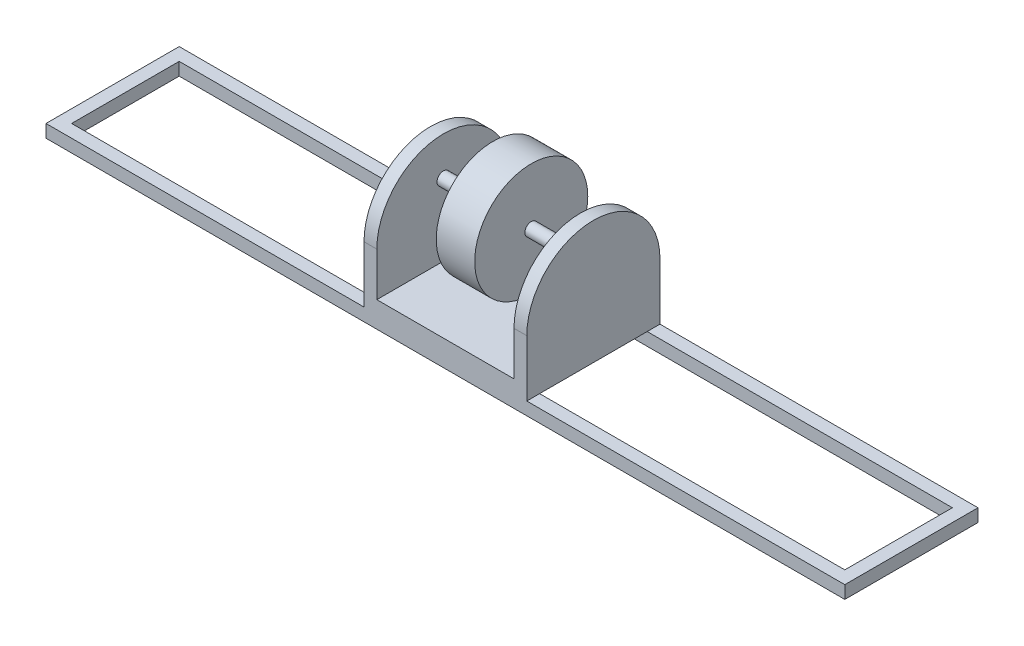
ISO-10303-21;
HEADER;
FILE_DESCRIPTION(('STEP AP214'),'2;1');
FILE_NAME('part.step','',(''),(''),'','','');
FILE_SCHEMA(('AUTOMOTIVE_DESIGN { 1 0 10303 214 1 1 1 1 }'));
ENDSEC;
DATA;
#1=APPLICATION_CONTEXT('core data for automotive mechanical design processes');
#2=APPLICATION_PROTOCOL_DEFINITION('international standard','automotive_design',2000,#1);
#3=PRODUCT_CONTEXT('',#1,'mechanical');
#4=PRODUCT('Part','Part','',(#3));
#5=PRODUCT_RELATED_PRODUCT_CATEGORY('part','',(#4));
#6=PRODUCT_DEFINITION_FORMATION('','',#4);
#7=PRODUCT_DEFINITION_CONTEXT('part definition',#1,'design');
#8=PRODUCT_DEFINITION('design','',#6,#7);
#9=PRODUCT_DEFINITION_SHAPE('','',#8);
#10=(LENGTH_UNIT() NAMED_UNIT(*) SI_UNIT(.MILLI.,.METRE.));
#11=(NAMED_UNIT(*) PLANE_ANGLE_UNIT() SI_UNIT($,.RADIAN.));
#12=(NAMED_UNIT(*) SI_UNIT($,.STERADIAN.) SOLID_ANGLE_UNIT());
#13=UNCERTAINTY_MEASURE_WITH_UNIT(LENGTH_MEASURE(1.E-05),#10,'distance_accuracy_value','');
#14=(GEOMETRIC_REPRESENTATION_CONTEXT(3) GLOBAL_UNCERTAINTY_ASSIGNED_CONTEXT((#13)) GLOBAL_UNIT_ASSIGNED_CONTEXT((#10,
#11,#12)) REPRESENTATION_CONTEXT('',''));
#15=CARTESIAN_POINT('',(0.,0.,0.));
#16=DIRECTION('',(0.,0.,1.));
#17=DIRECTION('',(1.,0.,0.));
#18=AXIS2_PLACEMENT_3D('',#15,#16,#17);
#19=CARTESIAN_POINT('',(155.284271247462,152.069350649587,-707.172403048339));
#20=DIRECTION('',(-1.,0.,0.));
#21=DIRECTION('',(0.,0.,1.));
#22=AXIS2_PLACEMENT_3D('',#19,#20,#21);
#23=CYLINDRICAL_SURFACE('',#22,9.99999999999998);
#24=CARTESIAN_POINT('',(-107.,152.069350649587,-707.172403048339));
#25=DIRECTION('',(1.,0.,0.));
#26=DIRECTION('',(0.,0.,-1.));
#27=AXIS2_PLACEMENT_3D('',#24,#25,#26);
#28=CIRCLE('',#27,9.99999999999998);
#29=CARTESIAN_POINT('',(-107.,152.069350649587,-717.172403048339));
#30=VERTEX_POINT('',#29);
#31=EDGE_CURVE('E394',#30,#30,#28,.T.);
#32=ORIENTED_EDGE('',*,*,#31,.T.);
#33=EDGE_LOOP('',(#32));
#34=FACE_BOUND('',#33,.T.);
#35=CARTESIAN_POINT('',(-30.,152.069350649587,-707.172403048339));
#36=DIRECTION('',(1.,0.,0.));
#37=DIRECTION('',(0.,0.,-1.));
#38=AXIS2_PLACEMENT_3D('',#35,#36,#37);
#39=CIRCLE('',#38,9.99999999999998);
#40=CARTESIAN_POINT('',(-30.,152.069350649587,-717.172403048339));
#41=VERTEX_POINT('',#40);
#42=EDGE_CURVE('E39',#41,#41,#39,.F.);
#43=ORIENTED_EDGE('',*,*,#42,.T.);
#44=EDGE_LOOP('',(#43));
#45=FACE_BOUND('',#44,.T.);
#46=ADVANCED_FACE('F35',(#34,#45),#23,.T.);
#47=CARTESIAN_POINT('',(0.,20.,0.));
#48=DIRECTION('',(0.,1.,0.));
#49=DIRECTION('',(0.,0.,1.));
#50=AXIS2_PLACEMENT_3D('',#47,#48,#49);
#51=PLANE('',#50);
#52=DIRECTION('',(0.,0.,-1.));
#53=VECTOR('',#52,1.);
#54=CARTESIAN_POINT('',(127.,20.,-811.094806096677));
#55=LINE('',#54,#53);
#56=CARTESIAN_POINT('',(127.,20.,-603.249999999996));
#57=VERTEX_POINT('',#56);
#58=CARTESIAN_POINT('',(127.,20.,-623.25));
#59=VERTEX_POINT('',#58);
#60=EDGE_CURVE('E219',#57,#59,#55,.T.);
#61=ORIENTED_EDGE('',*,*,#60,.F.);
#62=DIRECTION('',(-1.,0.,0.));
#63=VECTOR('',#62,1.);
#64=CARTESIAN_POINT('',(3.34871019802561E-12,20.,-603.249999999997));
#65=LINE('',#64,#63);
#66=CARTESIAN_POINT('',(623.25,20.,-603.25));
#67=VERTEX_POINT('',#66);
#68=EDGE_CURVE('E237',#67,#57,#65,.T.);
#69=ORIENTED_EDGE('',*,*,#68,.F.);
#70=DIRECTION('',(0.,0.,1.));
#71=VECTOR('',#70,1.);
#72=CARTESIAN_POINT('',(623.25,20.,0.));
#73=LINE('',#72,#71);
#74=CARTESIAN_POINT('',(623.25,20.,-811.094806096677));
#75=VERTEX_POINT('',#74);
#76=EDGE_CURVE('E240',#75,#67,#73,.T.);
#77=ORIENTED_EDGE('',*,*,#76,.F.);
#78=DIRECTION('',(1.,0.,0.));
#79=VECTOR('',#78,1.);
#80=CARTESIAN_POINT('',(0.,20.,-811.094806096677));
#81=LINE('',#80,#79);
#82=CARTESIAN_POINT('',(127.,20.,-811.094806096677));
#83=VERTEX_POINT('',#82);
#84=EDGE_CURVE('E244',#83,#75,#81,.T.);
#85=ORIENTED_EDGE('',*,*,#84,.F.);
#86=CARTESIAN_POINT('',(127.,20.,-791.094806096677));
#87=VERTEX_POINT('',#86);
#88=EDGE_CURVE('E44',#87,#83,#55,.T.);
#89=ORIENTED_EDGE('',*,*,#88,.F.);
#90=DIRECTION('',(1.,0.,0.));
#91=VECTOR('',#90,1.);
#92=CARTESIAN_POINT('',(0.,20.,-791.094806096677));
#93=LINE('',#92,#91);
#94=CARTESIAN_POINT('',(603.25,20.,-791.094806096677));
#95=VERTEX_POINT('',#94);
#96=EDGE_CURVE('E251',#87,#95,#93,.T.);
#97=ORIENTED_EDGE('',*,*,#96,.T.);
#98=DIRECTION('',(0.,0.,1.));
#99=VECTOR('',#98,1.);
#100=CARTESIAN_POINT('',(603.25,20.,0.));
#101=LINE('',#100,#99);
#102=CARTESIAN_POINT('',(603.25,20.,-623.25));
#103=VERTEX_POINT('',#102);
#104=EDGE_CURVE('E254',#95,#103,#101,.T.);
#105=ORIENTED_EDGE('',*,*,#104,.T.);
#106=DIRECTION('',(1.,0.,0.));
#107=VECTOR('',#106,1.);
#108=CARTESIAN_POINT('',(0.,20.,-623.25));
#109=LINE('',#108,#107);
#110=EDGE_CURVE('E258',#59,#103,#109,.T.);
#111=ORIENTED_EDGE('',*,*,#110,.F.);
#112=EDGE_LOOP('',(#61,#69,#77,#85,#89,#97,#105,#111));
#113=FACE_BOUND('',#112,.T.);
#114=ADVANCED_FACE('F319',(#113),#51,.T.);
#115=CARTESIAN_POINT('',(0.,20.,-791.094806096677));
#116=DIRECTION('',(0.,0.,-1.));
#117=DIRECTION('',(-1.,0.,0.));
#118=AXIS2_PLACEMENT_3D('',#115,#116,#117);
#119=PLANE('',#118);
#120=DIRECTION('',(1.,0.,0.));
#121=VECTOR('',#120,1.);
#122=CARTESIAN_POINT('',(0.,0.,-791.094806096677));
#123=LINE('',#122,#121);
#124=CARTESIAN_POINT('',(-603.25,0.,-791.094806096677));
#125=VERTEX_POINT('',#124);
#126=CARTESIAN_POINT('',(603.25,0.,-791.094806096677));
#127=VERTEX_POINT('',#126);
#128=EDGE_CURVE('E277',#125,#127,#123,.T.);
#129=ORIENTED_EDGE('',*,*,#128,.T.);
#130=DIRECTION('',(0.,-1.,0.));
#131=VECTOR('',#130,1.);
#132=CARTESIAN_POINT('',(603.25,20.,-791.094806096677));
#133=LINE('',#132,#131);
#134=EDGE_CURVE('E296',#95,#127,#133,.T.);
#135=ORIENTED_EDGE('',*,*,#134,.F.);
#136=ORIENTED_EDGE('',*,*,#96,.F.);
#137=CARTESIAN_POINT('',(-127.,20.,-791.094806096677));
#138=VERTEX_POINT('',#137);
#139=EDGE_CURVE('E255',#138,#87,#93,.T.);
#140=ORIENTED_EDGE('',*,*,#139,.F.);
#141=CARTESIAN_POINT('',(-603.25,20.,-791.094806096677));
#142=VERTEX_POINT('',#141);
#143=EDGE_CURVE('E252',#142,#138,#93,.T.);
#144=ORIENTED_EDGE('',*,*,#143,.F.);
#145=DIRECTION('',(0.,-1.,0.));
#146=VECTOR('',#145,1.);
#147=CARTESIAN_POINT('',(-603.25,20.,-791.094806096677));
#148=LINE('',#147,#146);
#149=EDGE_CURVE('E288',#142,#125,#148,.T.);
#150=ORIENTED_EDGE('',*,*,#149,.T.);
#151=EDGE_LOOP('',(#129,#135,#136,#140,#144,#150));
#152=FACE_BOUND('',#151,.T.);
#153=ADVANCED_FACE('F374',(#152),#119,.F.);
#154=CARTESIAN_POINT('',(603.25,20.,0.));
#155=DIRECTION('',(1.,0.,0.));
#156=DIRECTION('',(0.,0.,-1.));
#157=AXIS2_PLACEMENT_3D('',#154,#155,#156);
#158=PLANE('',#157);
#159=DIRECTION('',(0.,0.,1.));
#160=VECTOR('',#159,1.);
#161=CARTESIAN_POINT('',(603.25,0.,0.));
#162=LINE('',#161,#160);
#163=CARTESIAN_POINT('',(603.25,0.,-623.25));
#164=VERTEX_POINT('',#163);
#165=EDGE_CURVE('E280',#127,#164,#162,.T.);
#166=ORIENTED_EDGE('',*,*,#165,.T.);
#167=DIRECTION('',(0.,-1.,0.));
#168=VECTOR('',#167,1.);
#169=CARTESIAN_POINT('',(603.25,20.,-623.25));
#170=LINE('',#169,#168);
#171=EDGE_CURVE('E294',#103,#164,#170,.T.);
#172=ORIENTED_EDGE('',*,*,#171,.F.);
#173=ORIENTED_EDGE('',*,*,#104,.F.);
#174=ORIENTED_EDGE('',*,*,#134,.T.);
#175=EDGE_LOOP('',(#166,#172,#173,#174));
#176=FACE_BOUND('',#175,.T.);
#177=ADVANCED_FACE('F344',(#176),#158,.F.);
#178=CARTESIAN_POINT('',(0.,20.,-623.25));
#179=DIRECTION('',(0.,0.,-1.));
#180=DIRECTION('',(-1.,0.,0.));
#181=AXIS2_PLACEMENT_3D('',#178,#179,#180);
#182=PLANE('',#181);
#183=DIRECTION('',(1.,0.,0.));
#184=VECTOR('',#183,1.);
#185=CARTESIAN_POINT('',(0.,0.,-623.25));
#186=LINE('',#185,#184);
#187=CARTESIAN_POINT('',(-603.25,0.,-623.25));
#188=VERTEX_POINT('',#187);
#189=EDGE_CURVE('E283',#188,#164,#186,.T.);
#190=ORIENTED_EDGE('',*,*,#189,.F.);
#191=DIRECTION('',(0.,-1.,0.));
#192=VECTOR('',#191,1.);
#193=CARTESIAN_POINT('',(-603.25,20.,-623.25));
#194=LINE('',#193,#192);
#195=CARTESIAN_POINT('',(-603.25,20.,-623.25));
#196=VERTEX_POINT('',#195);
#197=EDGE_CURVE('E291',#196,#188,#194,.T.);
#198=ORIENTED_EDGE('',*,*,#197,.F.);
#199=CARTESIAN_POINT('',(-127.,20.,-623.25));
#200=VERTEX_POINT('',#199);
#201=EDGE_CURVE('E259',#196,#200,#109,.T.);
#202=ORIENTED_EDGE('',*,*,#201,.T.);
#203=EDGE_CURVE('E263',#200,#59,#109,.T.);
#204=ORIENTED_EDGE('',*,*,#203,.T.);
#205=ORIENTED_EDGE('',*,*,#110,.T.);
#206=ORIENTED_EDGE('',*,*,#171,.T.);
#207=EDGE_LOOP('',(#190,#198,#202,#204,#205,#206));
#208=FACE_BOUND('',#207,.T.);
#209=ADVANCED_FACE('F339',(#208),#182,.T.);
#210=CARTESIAN_POINT('',(3.34871019802561E-12,20.,-603.249999999997));
#211=DIRECTION('',(0.,0.,1.));
#212=DIRECTION('',(1.,0.,0.));
#213=AXIS2_PLACEMENT_3D('',#210,#211,#212);
#214=PLANE('',#213);
#215=DIRECTION('',(-1.,0.,0.));
#216=VECTOR('',#215,1.);
#217=CARTESIAN_POINT('',(3.34871019802561E-12,0.,-603.249999999997));
#218=LINE('',#217,#216);
#219=CARTESIAN_POINT('',(623.25,0.,-603.25));
#220=VERTEX_POINT('',#219);
#221=CARTESIAN_POINT('',(-623.25,0.,-603.25));
#222=VERTEX_POINT('',#221);
#223=EDGE_CURVE('E236',#220,#222,#218,.T.);
#224=ORIENTED_EDGE('',*,*,#223,.F.);
#225=DIRECTION('',(0.,-1.,0.));
#226=VECTOR('',#225,1.);
#227=CARTESIAN_POINT('',(623.25,20.,-603.25));
#228=LINE('',#227,#226);
#229=EDGE_CURVE('E292',#67,#220,#228,.T.);
#230=ORIENTED_EDGE('',*,*,#229,.F.);
#231=ORIENTED_EDGE('',*,*,#68,.T.);
#232=DIRECTION('',(0.,-1.,0.));
#233=VECTOR('',#232,1.);
#234=CARTESIAN_POINT('',(127.,40.,-603.25));
#235=LINE('',#234,#233);
#236=CARTESIAN_POINT('',(127.,108.279126424293,-603.25));
#237=VERTEX_POINT('',#236);
#238=EDGE_CURVE('E218',#237,#57,#235,.T.);
#239=ORIENTED_EDGE('',*,*,#238,.F.);
#240=DIRECTION('',(1.,0.,0.));
#241=VECTOR('',#240,1.);
#242=CARTESIAN_POINT('',(107.,108.279126424293,-603.25));
#243=LINE('',#242,#241);
#244=CARTESIAN_POINT('',(107.,108.279126424293,-603.25));
#245=VERTEX_POINT('',#244);
#246=EDGE_CURVE('E180',#245,#237,#243,.T.);
#247=ORIENTED_EDGE('',*,*,#246,.F.);
#248=DIRECTION('',(0.,1.,0.));
#249=VECTOR('',#248,1.);
#250=CARTESIAN_POINT('',(107.,40.,-603.25));
#251=LINE('',#250,#249);
#252=CARTESIAN_POINT('',(107.,40.,-603.25));
#253=VERTEX_POINT('',#252);
#254=EDGE_CURVE('E167',#253,#245,#251,.T.);
#255=ORIENTED_EDGE('',*,*,#254,.F.);
#256=DIRECTION('',(1.,0.,0.));
#257=VECTOR('',#256,1.);
#258=CARTESIAN_POINT('',(127.,40.,-603.25));
#259=LINE('',#258,#257);
#260=CARTESIAN_POINT('',(-107.,40.,-603.25));
#261=VERTEX_POINT('',#260);
#262=EDGE_CURVE('E51',#261,#253,#259,.T.);
#263=ORIENTED_EDGE('',*,*,#262,.F.);
#264=DIRECTION('',(0.,1.,0.));
#265=VECTOR('',#264,1.);
#266=CARTESIAN_POINT('',(-107.,40.,-603.25));
#267=LINE('',#266,#265);
#268=CARTESIAN_POINT('',(-107.,108.279126424293,-603.25));
#269=VERTEX_POINT('',#268);
#270=EDGE_CURVE('E200',#261,#269,#267,.T.);
#271=ORIENTED_EDGE('',*,*,#270,.T.);
#272=DIRECTION('',(-1.,0.,0.));
#273=VECTOR('',#272,1.);
#274=CARTESIAN_POINT('',(-107.,108.279126424293,-603.25));
#275=LINE('',#274,#273);
#276=CARTESIAN_POINT('',(-127.,108.279126424293,-603.25));
#277=VERTEX_POINT('',#276);
#278=EDGE_CURVE('E206',#269,#277,#275,.T.);
#279=ORIENTED_EDGE('',*,*,#278,.T.);
#280=DIRECTION('',(0.,-1.,0.));
#281=VECTOR('',#280,1.);
#282=CARTESIAN_POINT('',(-127.,40.,-603.25));
#283=LINE('',#282,#281);
#284=CARTESIAN_POINT('',(-127.,20.,-603.25));
#285=VERTEX_POINT('',#284);
#286=EDGE_CURVE('E228',#277,#285,#283,.T.);
#287=ORIENTED_EDGE('',*,*,#286,.T.);
#288=CARTESIAN_POINT('',(-623.25,20.,-603.25));
#289=VERTEX_POINT('',#288);
#290=EDGE_CURVE('E241',#285,#289,#65,.T.);
#291=ORIENTED_EDGE('',*,*,#290,.T.);
#292=DIRECTION('',(0.,-1.,0.));
#293=VECTOR('',#292,1.);
#294=CARTESIAN_POINT('',(-623.25,20.,-603.25));
#295=LINE('',#294,#293);
#296=EDGE_CURVE('E265',#289,#222,#295,.T.);
#297=ORIENTED_EDGE('',*,*,#296,.T.);
#298=EDGE_LOOP('',(#224,#230,#231,#239,#247,#255,#263,#271,#279,#287,#291,#297));
#299=FACE_BOUND('',#298,.T.);
#300=ADVANCED_FACE('F37',(#299),#214,.T.);
#301=CARTESIAN_POINT('',(623.25,20.,0.));
#302=DIRECTION('',(1.,0.,0.));
#303=DIRECTION('',(0.,0.,-1.));
#304=AXIS2_PLACEMENT_3D('',#301,#302,#303);
#305=PLANE('',#304);
#306=DIRECTION('',(0.,0.,1.));
#307=VECTOR('',#306,1.);
#308=CARTESIAN_POINT('',(623.25,0.,0.));
#309=LINE('',#308,#307);
#310=CARTESIAN_POINT('',(623.25,0.,-811.094806096677));
#311=VERTEX_POINT('',#310);
#312=EDGE_CURVE('E268',#311,#220,#309,.T.);
#313=ORIENTED_EDGE('',*,*,#312,.F.);
#314=DIRECTION('',(0.,-1.,0.));
#315=VECTOR('',#314,1.);
#316=CARTESIAN_POINT('',(623.25,20.,-811.094806096677));
#317=LINE('',#316,#315);
#318=EDGE_CURVE('E302',#75,#311,#317,.T.);
#319=ORIENTED_EDGE('',*,*,#318,.F.);
#320=ORIENTED_EDGE('',*,*,#76,.T.);
#321=ORIENTED_EDGE('',*,*,#229,.T.);
#322=EDGE_LOOP('',(#313,#319,#320,#321));
#323=FACE_BOUND('',#322,.T.);
#324=ADVANCED_FACE('F307',(#323),#305,.T.);
#325=CARTESIAN_POINT('',(0.,20.,-811.094806096677));
#326=DIRECTION('',(0.,0.,-1.));
#327=DIRECTION('',(-1.,0.,0.));
#328=AXIS2_PLACEMENT_3D('',#325,#326,#327);
#329=PLANE('',#328);
#330=DIRECTION('',(1.,0.,0.));
#331=VECTOR('',#330,1.);
#332=CARTESIAN_POINT('',(0.,0.,-811.094806096677));
#333=LINE('',#332,#331);
#334=CARTESIAN_POINT('',(-623.25,0.,-811.094806096677));
#335=VERTEX_POINT('',#334);
#336=EDGE_CURVE('E271',#335,#311,#333,.T.);
#337=ORIENTED_EDGE('',*,*,#336,.F.);
#338=DIRECTION('',(0.,-1.,0.));
#339=VECTOR('',#338,1.);
#340=CARTESIAN_POINT('',(-623.25,20.,-811.094806096677));
#341=LINE('',#340,#339);
#342=CARTESIAN_POINT('',(-623.25,20.,-811.094806096677));
#343=VERTEX_POINT('',#342);
#344=EDGE_CURVE('E300',#343,#335,#341,.T.);
#345=ORIENTED_EDGE('',*,*,#344,.F.);
#346=CARTESIAN_POINT('',(-127.,20.,-811.094806096677));
#347=VERTEX_POINT('',#346);
#348=EDGE_CURVE('E245',#343,#347,#81,.T.);
#349=ORIENTED_EDGE('',*,*,#348,.T.);
#350=DIRECTION('',(0.,-1.,0.));
#351=VECTOR('',#350,1.);
#352=CARTESIAN_POINT('',(-127.,40.,-811.094806096677));
#353=LINE('',#352,#351);
#354=CARTESIAN_POINT('',(-127.,108.279126424293,-811.094806096677));
#355=VERTEX_POINT('',#354);
#356=EDGE_CURVE('E231',#355,#347,#353,.T.);
#357=ORIENTED_EDGE('',*,*,#356,.F.);
#358=DIRECTION('',(-1.,0.,0.));
#359=VECTOR('',#358,1.);
#360=CARTESIAN_POINT('',(-107.,108.279126424293,-811.094806096677));
#361=LINE('',#360,#359);
#362=CARTESIAN_POINT('',(-107.,108.279126424293,-811.094806096677));
#363=VERTEX_POINT('',#362);
#364=EDGE_CURVE('E209',#363,#355,#361,.T.);
#365=ORIENTED_EDGE('',*,*,#364,.F.);
#366=DIRECTION('',(0.,-1.,0.));
#367=VECTOR('',#366,1.);
#368=CARTESIAN_POINT('',(-107.,40.,-811.094806096677));
#369=LINE('',#368,#367);
#370=CARTESIAN_POINT('',(-107.,40.,-811.094806096677));
#371=VERTEX_POINT('',#370);
#372=EDGE_CURVE('E196',#363,#371,#369,.T.);
#373=ORIENTED_EDGE('',*,*,#372,.T.);
#374=DIRECTION('',(-1.,0.,0.));
#375=VECTOR('',#374,1.);
#376=CARTESIAN_POINT('',(127.,40.,-811.094806096677));
#377=LINE('',#376,#375);
#378=CARTESIAN_POINT('',(107.,40.,-811.094806096677));
#379=VERTEX_POINT('',#378);
#380=EDGE_CURVE('E185',#379,#371,#377,.T.);
#381=ORIENTED_EDGE('',*,*,#380,.F.);
#382=DIRECTION('',(0.,-1.,0.));
#383=VECTOR('',#382,1.);
#384=CARTESIAN_POINT('',(107.,40.,-811.094806096677));
#385=LINE('',#384,#383);
#386=CARTESIAN_POINT('',(107.,108.279126424293,-811.094806096677));
#387=VERTEX_POINT('',#386);
#388=EDGE_CURVE('E165',#387,#379,#385,.T.);
#389=ORIENTED_EDGE('',*,*,#388,.F.);
#390=DIRECTION('',(1.,0.,0.));
#391=VECTOR('',#390,1.);
#392=CARTESIAN_POINT('',(107.,108.279126424293,-811.094806096677));
#393=LINE('',#392,#391);
#394=CARTESIAN_POINT('',(127.,108.279126424293,-811.094806096677));
#395=VERTEX_POINT('',#394);
#396=EDGE_CURVE('E174',#387,#395,#393,.T.);
#397=ORIENTED_EDGE('',*,*,#396,.T.);
#398=DIRECTION('',(0.,-1.,0.));
#399=VECTOR('',#398,1.);
#400=CARTESIAN_POINT('',(127.,40.,-811.094806096677));
#401=LINE('',#400,#399);
#402=EDGE_CURVE('E234',#395,#83,#401,.T.);
#403=ORIENTED_EDGE('',*,*,#402,.T.);
#404=ORIENTED_EDGE('',*,*,#84,.T.);
#405=ORIENTED_EDGE('',*,*,#318,.T.);
#406=EDGE_LOOP('',(#337,#345,#349,#357,#365,#373,#381,#389,#397,#403,#404,#405));
#407=FACE_BOUND('',#406,.T.);
#408=ADVANCED_FACE('F183',(#407),#329,.T.);
#409=CARTESIAN_POINT('',(-623.25,20.,0.));
#410=DIRECTION('',(-1.,0.,0.));
#411=DIRECTION('',(0.,0.,1.));
#412=AXIS2_PLACEMENT_3D('',#409,#410,#411);
#413=PLANE('',#412);
#414=DIRECTION('',(0.,0.,-1.));
#415=VECTOR('',#414,1.);
#416=CARTESIAN_POINT('',(-623.25,0.,0.));
#417=LINE('',#416,#415);
#418=EDGE_CURVE('E274',#222,#335,#417,.T.);
#419=ORIENTED_EDGE('',*,*,#418,.F.);
#420=ORIENTED_EDGE('',*,*,#296,.F.);
#421=DIRECTION('',(0.,0.,-1.));
#422=VECTOR('',#421,1.);
#423=CARTESIAN_POINT('',(-623.25,20.,0.));
#424=LINE('',#423,#422);
#425=EDGE_CURVE('E248',#289,#343,#424,.T.);
#426=ORIENTED_EDGE('',*,*,#425,.T.);
#427=ORIENTED_EDGE('',*,*,#344,.T.);
#428=EDGE_LOOP('',(#419,#420,#426,#427));
#429=FACE_BOUND('',#428,.T.);
#430=ADVANCED_FACE('F357',(#429),#413,.T.);
#431=CARTESIAN_POINT('',(-603.25,20.,0.));
#432=DIRECTION('',(-1.,0.,0.));
#433=DIRECTION('',(0.,0.,1.));
#434=AXIS2_PLACEMENT_3D('',#431,#432,#433);
#435=PLANE('',#434);
#436=DIRECTION('',(0.,0.,-1.));
#437=VECTOR('',#436,1.);
#438=CARTESIAN_POINT('',(-603.25,0.,0.));
#439=LINE('',#438,#437);
#440=EDGE_CURVE('E286',#188,#125,#439,.T.);
#441=ORIENTED_EDGE('',*,*,#440,.T.);
#442=ORIENTED_EDGE('',*,*,#149,.F.);
#443=DIRECTION('',(0.,0.,-1.));
#444=VECTOR('',#443,1.);
#445=CARTESIAN_POINT('',(-603.25,20.,0.));
#446=LINE('',#445,#444);
#447=EDGE_CURVE('E262',#196,#142,#446,.T.);
#448=ORIENTED_EDGE('',*,*,#447,.F.);
#449=ORIENTED_EDGE('',*,*,#197,.T.);
#450=EDGE_LOOP('',(#441,#442,#448,#449));
#451=FACE_BOUND('',#450,.T.);
#452=ADVANCED_FACE('F351',(#451),#435,.F.);
#453=DIRECTION('',(0.,0.,1.));
#454=VECTOR('',#453,1.);
#455=CARTESIAN_POINT('',(-127.,20.,-811.094806096677));
#456=LINE('',#455,#454);
#457=EDGE_CURVE('E216',#347,#138,#456,.T.);
#458=ORIENTED_EDGE('',*,*,#457,.F.);
#459=ORIENTED_EDGE('',*,*,#348,.F.);
#460=ORIENTED_EDGE('',*,*,#425,.F.);
#461=ORIENTED_EDGE('',*,*,#290,.F.);
#462=EDGE_CURVE('E225',#200,#285,#456,.T.);
#463=ORIENTED_EDGE('',*,*,#462,.F.);
#464=ORIENTED_EDGE('',*,*,#201,.F.);
#465=ORIENTED_EDGE('',*,*,#447,.T.);
#466=ORIENTED_EDGE('',*,*,#143,.T.);
#467=EDGE_LOOP('',(#458,#459,#460,#461,#463,#464,#465,#466));
#468=FACE_BOUND('',#467,.T.);
#469=ADVANCED_FACE('F354',(#468),#51,.T.);
#470=CARTESIAN_POINT('',(0.,0.,0.));
#471=DIRECTION('',(0.,1.,0.));
#472=DIRECTION('',(0.,0.,1.));
#473=AXIS2_PLACEMENT_3D('',#470,#471,#472);
#474=PLANE('',#473);
#475=ORIENTED_EDGE('',*,*,#223,.T.);
#476=ORIENTED_EDGE('',*,*,#418,.T.);
#477=ORIENTED_EDGE('',*,*,#336,.T.);
#478=ORIENTED_EDGE('',*,*,#312,.T.);
#479=EDGE_LOOP('',(#475,#476,#477,#478));
#480=FACE_BOUND('',#479,.T.);
#481=ORIENTED_EDGE('',*,*,#128,.F.);
#482=ORIENTED_EDGE('',*,*,#440,.F.);
#483=ORIENTED_EDGE('',*,*,#189,.T.);
#484=ORIENTED_EDGE('',*,*,#165,.F.);
#485=EDGE_LOOP('',(#481,#482,#483,#484));
#486=FACE_BOUND('',#485,.T.);
#487=ADVANCED_FACE('F315',(#480,#486),#474,.F.);
#488=CARTESIAN_POINT('',(0.,20.,0.));
#489=DIRECTION('',(0.,-1.,0.));
#490=DIRECTION('',(0.,0.,-1.));
#491=AXIS2_PLACEMENT_3D('',#488,#489,#490);
#492=PLANE('',#491);
#493=EDGE_CURVE('E222',#138,#200,#456,.T.);
#494=ORIENTED_EDGE('',*,*,#493,.F.);
#495=ORIENTED_EDGE('',*,*,#139,.T.);
#496=EDGE_CURVE('E212',#59,#87,#55,.T.);
#497=ORIENTED_EDGE('',*,*,#496,.F.);
#498=ORIENTED_EDGE('',*,*,#203,.F.);
#499=EDGE_LOOP('',(#494,#495,#497,#498));
#500=FACE_BOUND('',#499,.T.);
#501=ADVANCED_FACE('F334',(#500),#492,.T.);
#502=CARTESIAN_POINT('',(127.,40.,-811.094806096677));
#503=DIRECTION('',(-1.,0.,0.));
#504=DIRECTION('',(0.,0.,1.));
#505=AXIS2_PLACEMENT_3D('',#502,#503,#504);
#506=PLANE('',#505);
#507=ORIENTED_EDGE('',*,*,#60,.T.);
#508=ORIENTED_EDGE('',*,*,#496,.T.);
#509=ORIENTED_EDGE('',*,*,#88,.T.);
#510=ORIENTED_EDGE('',*,*,#402,.F.);
#511=CARTESIAN_POINT('',(127.,108.279126424293,-707.172403048339));
#512=DIRECTION('',(-1.,0.,0.));
#513=DIRECTION('',(0.,0.,-1.));
#514=AXIS2_PLACEMENT_3D('',#511,#512,#513);
#515=CIRCLE('',#514,103.922403048339);
#516=EDGE_CURVE('E177',#237,#395,#515,.T.);
#517=ORIENTED_EDGE('',*,*,#516,.F.);
#518=ORIENTED_EDGE('',*,*,#238,.T.);
#519=EDGE_LOOP('',(#507,#508,#509,#510,#517,#518));
#520=FACE_BOUND('',#519,.T.);
#521=ADVANCED_FACE('F322',(#520),#506,.F.);
#522=CARTESIAN_POINT('',(-127.,40.,-811.094806096677));
#523=DIRECTION('',(1.,0.,0.));
#524=DIRECTION('',(0.,0.,-1.));
#525=AXIS2_PLACEMENT_3D('',#522,#523,#524);
#526=PLANE('',#525);
#527=ORIENTED_EDGE('',*,*,#457,.T.);
#528=ORIENTED_EDGE('',*,*,#493,.T.);
#529=ORIENTED_EDGE('',*,*,#462,.T.);
#530=ORIENTED_EDGE('',*,*,#286,.F.);
#531=CARTESIAN_POINT('',(-127.,108.279126424293,-707.172403048339));
#532=DIRECTION('',(-1.,0.,0.));
#533=DIRECTION('',(0.,0.,-1.));
#534=AXIS2_PLACEMENT_3D('',#531,#532,#533);
#535=CIRCLE('',#534,103.922403048339);
#536=EDGE_CURVE('E194',#277,#355,#535,.T.);
#537=ORIENTED_EDGE('',*,*,#536,.T.);
#538=ORIENTED_EDGE('',*,*,#356,.T.);
#539=EDGE_LOOP('',(#527,#528,#529,#530,#537,#538));
#540=FACE_BOUND('',#539,.T.);
#541=ADVANCED_FACE('F330',(#540),#526,.F.);
#542=CARTESIAN_POINT('',(0.,40.,0.));
#543=DIRECTION('',(0.,-1.,0.));
#544=DIRECTION('',(0.,0.,-1.));
#545=AXIS2_PLACEMENT_3D('',#542,#543,#544);
#546=PLANE('',#545);
#547=ORIENTED_EDGE('',*,*,#262,.T.);
#548=DIRECTION('',(0.,0.,1.));
#549=VECTOR('',#548,1.);
#550=CARTESIAN_POINT('',(107.,40.,-811.094806096677));
#551=LINE('',#550,#549);
#552=EDGE_CURVE('E55',#379,#253,#551,.T.);
#553=ORIENTED_EDGE('',*,*,#552,.F.);
#554=ORIENTED_EDGE('',*,*,#380,.T.);
#555=DIRECTION('',(0.,0.,1.));
#556=VECTOR('',#555,1.);
#557=CARTESIAN_POINT('',(-107.,40.,-811.094806096677));
#558=LINE('',#557,#556);
#559=EDGE_CURVE('E198',#371,#261,#558,.T.);
#560=ORIENTED_EDGE('',*,*,#559,.T.);
#561=EDGE_LOOP('',(#547,#553,#554,#560));
#562=FACE_BOUND('',#561,.T.);
#563=ADVANCED_FACE('F438',(#562),#546,.F.);
#564=CARTESIAN_POINT('',(-107.,108.279126424293,-707.172403048339));
#565=DIRECTION('',(-1.,0.,0.));
#566=DIRECTION('',(0.,0.,1.));
#567=AXIS2_PLACEMENT_3D('',#564,#565,#566);
#568=CYLINDRICAL_SURFACE('',#567,103.922403048339);
#569=ORIENTED_EDGE('',*,*,#536,.F.);
#570=ORIENTED_EDGE('',*,*,#278,.F.);
#571=CARTESIAN_POINT('',(-107.,108.279126424293,-707.172403048339));
#572=DIRECTION('',(-1.,0.,0.));
#573=DIRECTION('',(0.,0.,-1.));
#574=AXIS2_PLACEMENT_3D('',#571,#572,#573);
#575=CIRCLE('',#574,103.922403048339);
#576=EDGE_CURVE('E203',#269,#363,#575,.T.);
#577=ORIENTED_EDGE('',*,*,#576,.T.);
#578=ORIENTED_EDGE('',*,*,#364,.T.);
#579=EDGE_LOOP('',(#569,#570,#577,#578));
#580=FACE_BOUND('',#579,.T.);
#581=ADVANCED_FACE('F477',(#580),#568,.T.);
#582=CARTESIAN_POINT('',(-107.,108.279126424293,-707.172403048339));
#583=DIRECTION('',(1.,0.,0.));
#584=DIRECTION('',(0.,0.,-1.));
#585=AXIS2_PLACEMENT_3D('',#582,#583,#584);
#586=PLANE('',#585);
#587=ORIENTED_EDGE('',*,*,#31,.F.);
#588=EDGE_LOOP('',(#587));
#589=FACE_BOUND('',#588,.T.);
#590=ORIENTED_EDGE('',*,*,#372,.F.);
#591=ORIENTED_EDGE('',*,*,#576,.F.);
#592=ORIENTED_EDGE('',*,*,#270,.F.);
#593=ORIENTED_EDGE('',*,*,#559,.F.);
#594=EDGE_LOOP('',(#590,#591,#592,#593));
#595=FACE_BOUND('',#594,.T.);
#596=ADVANCED_FACE('F469',(#589,#595),#586,.T.);
#597=CARTESIAN_POINT('',(107.,108.279126424293,-707.172403048339));
#598=DIRECTION('',(-1.,0.,0.));
#599=DIRECTION('',(0.,0.,-1.));
#600=AXIS2_PLACEMENT_3D('',#597,#598,#599);
#601=PLANE('',#600);
#602=ORIENTED_EDGE('',*,*,#388,.T.);
#603=ORIENTED_EDGE('',*,*,#552,.T.);
#604=ORIENTED_EDGE('',*,*,#254,.T.);
#605=CARTESIAN_POINT('',(107.,108.279126424293,-707.172403048339));
#606=DIRECTION('',(-1.,0.,0.));
#607=DIRECTION('',(0.,0.,-1.));
#608=AXIS2_PLACEMENT_3D('',#605,#606,#607);
#609=CIRCLE('',#608,103.922403048339);
#610=EDGE_CURVE('E160',#245,#387,#609,.T.);
#611=ORIENTED_EDGE('',*,*,#610,.T.);
#612=EDGE_LOOP('',(#602,#603,#604,#611));
#613=FACE_BOUND('',#612,.T.);
#614=CARTESIAN_POINT('',(107.,152.069350649587,-707.172403048339));
#615=DIRECTION('',(-1.,0.,0.));
#616=DIRECTION('',(0.,0.,1.));
#617=AXIS2_PLACEMENT_3D('',#614,#615,#616);
#618=CIRCLE('',#617,9.99999999999998);
#619=CARTESIAN_POINT('',(107.,152.069350649587,-697.172403048339));
#620=VERTEX_POINT('',#619);
#621=EDGE_CURVE('E187',#620,#620,#618,.T.);
#622=ORIENTED_EDGE('',*,*,#621,.F.);
#623=EDGE_LOOP('',(#622));
#624=FACE_BOUND('',#623,.T.);
#625=ADVANCED_FACE('F162',(#613,#624),#601,.T.);
#626=CARTESIAN_POINT('',(107.,108.279126424293,-707.172403048339));
#627=DIRECTION('',(1.,0.,0.));
#628=DIRECTION('',(0.,0.,-1.));
#629=AXIS2_PLACEMENT_3D('',#626,#627,#628);
#630=CYLINDRICAL_SURFACE('',#629,103.922403048339);
#631=ORIENTED_EDGE('',*,*,#516,.T.);
#632=ORIENTED_EDGE('',*,*,#396,.F.);
#633=ORIENTED_EDGE('',*,*,#610,.F.);
#634=ORIENTED_EDGE('',*,*,#246,.T.);
#635=EDGE_LOOP('',(#631,#632,#633,#634));
#636=FACE_BOUND('',#635,.T.);
#637=ADVANCED_FACE('F175',(#636),#630,.T.);
#638=CARTESIAN_POINT('',(30.,152.069350649587,-707.172403048339));
#639=DIRECTION('',(1.,0.,0.));
#640=DIRECTION('',(0.,0.,-1.));
#641=AXIS2_PLACEMENT_3D('',#638,#639,#640);
#642=CIRCLE('',#641,9.99999999999998);
#643=CARTESIAN_POINT('',(30.,152.069350649587,-717.172403048339));
#644=VERTEX_POINT('',#643);
#645=EDGE_CURVE('E11',#644,#644,#642,.F.);
#646=ORIENTED_EDGE('',*,*,#645,.F.);
#647=EDGE_LOOP('',(#646));
#648=FACE_BOUND('',#647,.T.);
#649=ORIENTED_EDGE('',*,*,#621,.T.);
#650=EDGE_LOOP('',(#649));
#651=FACE_BOUND('',#650,.T.);
#652=ADVANCED_FACE('F370',(#648,#651),#23,.T.);
#653=CARTESIAN_POINT('',(-30.,152.069350649587,-707.172403048339));
#654=DIRECTION('',(1.,0.,0.));
#655=DIRECTION('',(0.,0.,-1.));
#656=AXIS2_PLACEMENT_3D('',#653,#654,#655);
#657=CYLINDRICAL_SURFACE('',#656,88.2446058202784);
#658=CARTESIAN_POINT('',(-30.,152.069350649587,-707.172403048339));
#659=DIRECTION('',(1.,0.,0.));
#660=DIRECTION('',(0.,0.,-1.));
#661=AXIS2_PLACEMENT_3D('',#658,#659,#660);
#662=CIRCLE('',#661,88.2446058202784);
#663=CARTESIAN_POINT('',(-30.,152.069350649587,-795.417008868617));
#664=VERTEX_POINT('',#663);
#665=EDGE_CURVE('E397',#664,#664,#662,.T.);
#666=ORIENTED_EDGE('',*,*,#665,.T.);
#667=EDGE_LOOP('',(#666));
#668=FACE_BOUND('',#667,.T.);
#669=CARTESIAN_POINT('',(30.,152.069350649587,-707.172403048339));
#670=DIRECTION('',(1.,0.,0.));
#671=DIRECTION('',(0.,0.,-1.));
#672=AXIS2_PLACEMENT_3D('',#669,#670,#671);
#673=CIRCLE('',#672,88.2446058202784);
#674=CARTESIAN_POINT('',(30.,152.069350649587,-795.417008868617));
#675=VERTEX_POINT('',#674);
#676=EDGE_CURVE('E401',#675,#675,#673,.T.);
#677=ORIENTED_EDGE('',*,*,#676,.F.);
#678=EDGE_LOOP('',(#677));
#679=FACE_BOUND('',#678,.T.);
#680=ADVANCED_FACE('F381',(#668,#679),#657,.T.);
#681=CARTESIAN_POINT('',(-30.,152.069350649587,-707.172403048339));
#682=DIRECTION('',(1.,0.,0.));
#683=DIRECTION('',(0.,0.,-1.));
#684=AXIS2_PLACEMENT_3D('',#681,#682,#683);
#685=PLANE('',#684);
#686=ORIENTED_EDGE('',*,*,#42,.F.);
#687=EDGE_LOOP('',(#686));
#688=FACE_BOUND('',#687,.T.);
#689=ORIENTED_EDGE('',*,*,#665,.F.);
#690=EDGE_LOOP('',(#689));
#691=FACE_BOUND('',#690,.T.);
#692=ADVANCED_FACE('F387',(#688,#691),#685,.F.);
#693=CARTESIAN_POINT('',(30.,152.069350649587,-707.172403048339));
#694=DIRECTION('',(1.,0.,0.));
#695=DIRECTION('',(0.,0.,-1.));
#696=AXIS2_PLACEMENT_3D('',#693,#694,#695);
#697=PLANE('',#696);
#698=ORIENTED_EDGE('',*,*,#645,.T.);
#699=EDGE_LOOP('',(#698));
#700=FACE_BOUND('',#699,.T.);
#701=ORIENTED_EDGE('',*,*,#676,.T.);
#702=EDGE_LOOP('',(#701));
#703=FACE_BOUND('',#702,.T.);
#704=ADVANCED_FACE('F405',(#700,#703),#697,.T.);
#705=CLOSED_SHELL('',(#46,#114,#153,#177,#209,#300,#324,#408,#430,#452,#469,#487,#501,#521,#541,
#563,#581,#596,#625,#637,#652,#680,#692,#704));
#706=MANIFOLD_SOLID_BREP('B2',#705);
#707=ADVANCED_BREP_SHAPE_REPRESENTATION('',(#18,#706),#14);
#708=SHAPE_DEFINITION_REPRESENTATION(#9,#707);
ENDSEC;
END-ISO-10303-21;
